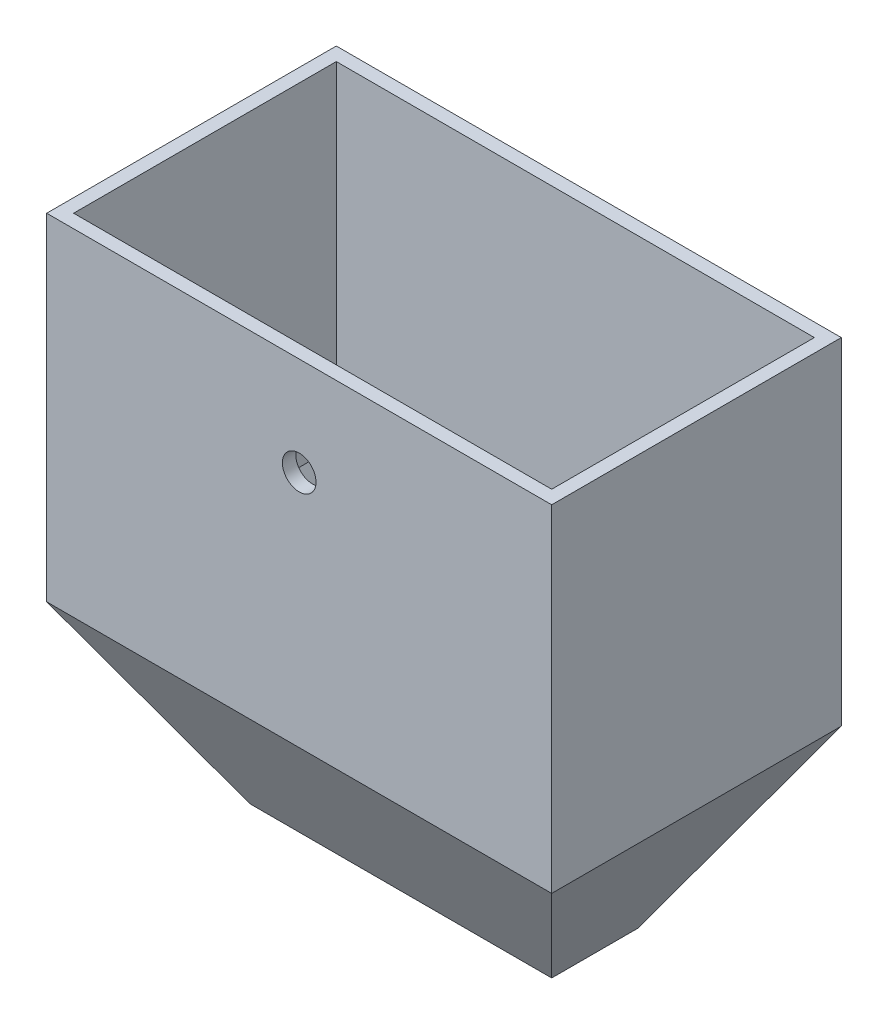
ISO-10303-21;
HEADER;
FILE_DESCRIPTION(('STEP AP214'),'2;1');
FILE_NAME('part.step','',(''),(''),'','','');
FILE_SCHEMA(('AUTOMOTIVE_DESIGN { 1 0 10303 214 1 1 1 1 }'));
ENDSEC;
DATA;
#1=APPLICATION_CONTEXT('core data for automotive mechanical design processes');
#2=APPLICATION_PROTOCOL_DEFINITION('international standard','automotive_design',2000,#1);
#3=PRODUCT_CONTEXT('',#1,'mechanical');
#4=PRODUCT('Part','Part','',(#3));
#5=PRODUCT_RELATED_PRODUCT_CATEGORY('part','',(#4));
#6=PRODUCT_DEFINITION_FORMATION('','',#4);
#7=PRODUCT_DEFINITION_CONTEXT('part definition',#1,'design');
#8=PRODUCT_DEFINITION('design','',#6,#7);
#9=PRODUCT_DEFINITION_SHAPE('','',#8);
#10=(LENGTH_UNIT() NAMED_UNIT(*) SI_UNIT(.MILLI.,.METRE.));
#11=(NAMED_UNIT(*) PLANE_ANGLE_UNIT() SI_UNIT($,.RADIAN.));
#12=(NAMED_UNIT(*) SI_UNIT($,.STERADIAN.) SOLID_ANGLE_UNIT());
#13=UNCERTAINTY_MEASURE_WITH_UNIT(LENGTH_MEASURE(1.E-05),#10,'distance_accuracy_value','');
#14=(GEOMETRIC_REPRESENTATION_CONTEXT(3) GLOBAL_UNCERTAINTY_ASSIGNED_CONTEXT((#13)) GLOBAL_UNIT_ASSIGNED_CONTEXT((#10,
#11,#12)) REPRESENTATION_CONTEXT('',''));
#15=CARTESIAN_POINT('',(0.,0.,0.));
#16=DIRECTION('',(0.,0.,1.));
#17=DIRECTION('',(1.,0.,0.));
#18=AXIS2_PLACEMENT_3D('',#15,#16,#17);
#19=CARTESIAN_POINT('',(187.57,250.,-107.57));
#20=DIRECTION('',(-1.,0.,0.));
#21=DIRECTION('',(0.,0.,1.));
#22=AXIS2_PLACEMENT_3D('',#19,#20,#21);
#23=PLANE('',#22);
#24=DIRECTION('',(0.,0.,1.));
#25=VECTOR('',#24,1.);
#26=CARTESIAN_POINT('',(187.57,0.,-107.57));
#27=LINE('',#26,#25);
#28=CARTESIAN_POINT('',(187.57,0.,107.57));
#29=VERTEX_POINT('',#28);
#30=CARTESIAN_POINT('',(187.57,0.,-107.57));
#31=VERTEX_POINT('',#30);
#32=EDGE_CURVE('E266',#29,#31,#27,.F.);
#33=ORIENTED_EDGE('',*,*,#32,.T.);
#34=DIRECTION('',(0.,-1.,0.));
#35=VECTOR('',#34,1.);
#36=CARTESIAN_POINT('',(187.57,250.,-107.57));
#37=LINE('',#36,#35);
#38=CARTESIAN_POINT('',(187.57,250.,-107.57));
#39=VERTEX_POINT('',#38);
#40=EDGE_CURVE('E12',#39,#31,#37,.T.);
#41=ORIENTED_EDGE('',*,*,#40,.F.);
#42=DIRECTION('',(0.,0.,-1.));
#43=VECTOR('',#42,1.);
#44=CARTESIAN_POINT('',(187.57,250.,-107.57));
#45=LINE('',#44,#43);
#46=CARTESIAN_POINT('',(187.57,250.,107.57));
#47=VERTEX_POINT('',#46);
#48=EDGE_CURVE('E385',#47,#39,#45,.T.);
#49=ORIENTED_EDGE('',*,*,#48,.F.);
#50=DIRECTION('',(0.,-1.,0.));
#51=VECTOR('',#50,1.);
#52=CARTESIAN_POINT('',(187.57,250.,107.57));
#53=LINE('',#52,#51);
#54=EDGE_CURVE('E399',#47,#29,#53,.T.);
#55=ORIENTED_EDGE('',*,*,#54,.T.);
#56=EDGE_LOOP('',(#33,#41,#49,#55));
#57=FACE_BOUND('',#56,.T.);
#58=ADVANCED_FACE('F47',(#57),#23,.F.);
#59=CARTESIAN_POINT('',(-187.57,250.,-107.57));
#60=DIRECTION('',(0.,0.,1.));
#61=DIRECTION('',(1.,0.,0.));
#62=AXIS2_PLACEMENT_3D('',#59,#60,#61);
#63=PLANE('',#62);
#64=DIRECTION('',(1.,0.,0.));
#65=VECTOR('',#64,1.);
#66=CARTESIAN_POINT('',(-187.57,0.,-107.57));
#67=LINE('',#66,#65);
#68=CARTESIAN_POINT('',(-187.57,0.,-107.57));
#69=VERTEX_POINT('',#68);
#70=EDGE_CURVE('E410',#31,#69,#67,.F.);
#71=ORIENTED_EDGE('',*,*,#70,.T.);
#72=DIRECTION('',(0.,-1.,0.));
#73=VECTOR('',#72,1.);
#74=CARTESIAN_POINT('',(-187.57,250.,-107.57));
#75=LINE('',#74,#73);
#76=CARTESIAN_POINT('',(-187.57,250.,-107.57));
#77=VERTEX_POINT('',#76);
#78=EDGE_CURVE('E55',#77,#69,#75,.T.);
#79=ORIENTED_EDGE('',*,*,#78,.F.);
#80=DIRECTION('',(-1.,0.,0.));
#81=VECTOR('',#80,1.);
#82=CARTESIAN_POINT('',(-187.57,250.,-107.57));
#83=LINE('',#82,#81);
#84=EDGE_CURVE('E393',#39,#77,#83,.T.);
#85=ORIENTED_EDGE('',*,*,#84,.F.);
#86=ORIENTED_EDGE('',*,*,#40,.T.);
#87=EDGE_LOOP('',(#71,#79,#85,#86));
#88=FACE_BOUND('',#87,.T.);
#89=ADVANCED_FACE('F430',(#88),#63,.F.);
#90=CARTESIAN_POINT('',(-187.57,250.,-107.57));
#91=DIRECTION('',(1.,0.,0.));
#92=DIRECTION('',(0.,0.,-1.));
#93=AXIS2_PLACEMENT_3D('',#90,#91,#92);
#94=PLANE('',#93);
#95=DIRECTION('',(0.,0.,-1.));
#96=VECTOR('',#95,1.);
#97=CARTESIAN_POINT('',(-187.57,0.,-107.57));
#98=LINE('',#97,#96);
#99=CARTESIAN_POINT('',(-187.57,0.,107.57));
#100=VERTEX_POINT('',#99);
#101=EDGE_CURVE('E407',#69,#100,#98,.F.);
#102=ORIENTED_EDGE('',*,*,#101,.T.);
#103=DIRECTION('',(0.,-1.,0.));
#104=VECTOR('',#103,1.);
#105=CARTESIAN_POINT('',(-187.57,250.,107.57));
#106=LINE('',#105,#104);
#107=CARTESIAN_POINT('',(-187.57,250.,107.57));
#108=VERTEX_POINT('',#107);
#109=EDGE_CURVE('E402',#108,#100,#106,.T.);
#110=ORIENTED_EDGE('',*,*,#109,.F.);
#111=DIRECTION('',(0.,0.,1.));
#112=VECTOR('',#111,1.);
#113=CARTESIAN_POINT('',(-187.57,250.,-107.57));
#114=LINE('',#113,#112);
#115=EDGE_CURVE('E395',#77,#108,#114,.T.);
#116=ORIENTED_EDGE('',*,*,#115,.F.);
#117=ORIENTED_EDGE('',*,*,#78,.T.);
#118=EDGE_LOOP('',(#102,#110,#116,#117));
#119=FACE_BOUND('',#118,.T.);
#120=ADVANCED_FACE('F426',(#119),#94,.F.);
#121=CARTESIAN_POINT('',(-187.57,250.,107.57));
#122=DIRECTION('',(0.,0.,-1.));
#123=DIRECTION('',(-1.,0.,0.));
#124=AXIS2_PLACEMENT_3D('',#121,#122,#123);
#125=PLANE('',#124);
#126=CARTESIAN_POINT('',(0.,177.,107.57));
#127=DIRECTION('',(0.,0.,1.));
#128=DIRECTION('',(1.,0.,0.));
#129=AXIS2_PLACEMENT_3D('',#126,#127,#128);
#130=CIRCLE('',#129,12.5);
#131=CARTESIAN_POINT('',(12.5,177.,107.57));
#132=VERTEX_POINT('',#131);
#133=EDGE_CURVE('E197',#132,#132,#130,.T.);
#134=ORIENTED_EDGE('',*,*,#133,.F.);
#135=EDGE_LOOP('',(#134));
#136=FACE_BOUND('',#135,.T.);
#137=DIRECTION('',(-1.,0.,0.));
#138=VECTOR('',#137,1.);
#139=CARTESIAN_POINT('',(-187.57,0.,107.57));
#140=LINE('',#139,#138);
#141=EDGE_CURVE('E50',#100,#29,#140,.F.);
#142=ORIENTED_EDGE('',*,*,#141,.T.);
#143=ORIENTED_EDGE('',*,*,#54,.F.);
#144=DIRECTION('',(1.,0.,0.));
#145=VECTOR('',#144,1.);
#146=CARTESIAN_POINT('',(-187.57,250.,107.57));
#147=LINE('',#146,#145);
#148=EDGE_CURVE('E397',#108,#47,#147,.T.);
#149=ORIENTED_EDGE('',*,*,#148,.F.);
#150=ORIENTED_EDGE('',*,*,#109,.T.);
#151=EDGE_LOOP('',(#142,#143,#149,#150));
#152=FACE_BOUND('',#151,.T.);
#153=ADVANCED_FACE('F422',(#136,#152),#125,.F.);
#154=CARTESIAN_POINT('',(0.,250.,0.));
#155=DIRECTION('',(0.,1.,0.));
#156=DIRECTION('',(0.,0.,1.));
#157=AXIS2_PLACEMENT_3D('',#154,#155,#156);
#158=PLANE('',#157);
#159=DIRECTION('',(0.,0.,-1.));
#160=VECTOR('',#159,1.);
#161=CARTESIAN_POINT('',(177.57,250.,-107.57));
#162=LINE('',#161,#160);
#163=CARTESIAN_POINT('',(177.57,250.,97.57));
#164=VERTEX_POINT('',#163);
#165=CARTESIAN_POINT('',(177.57,250.,-97.57));
#166=VERTEX_POINT('',#165);
#167=EDGE_CURVE('E232',#164,#166,#162,.T.);
#168=ORIENTED_EDGE('',*,*,#167,.F.);
#169=DIRECTION('',(1.,0.,0.));
#170=VECTOR('',#169,1.);
#171=CARTESIAN_POINT('',(-187.57,250.,97.57));
#172=LINE('',#171,#170);
#173=CARTESIAN_POINT('',(-177.57,250.,97.57));
#174=VERTEX_POINT('',#173);
#175=EDGE_CURVE('E220',#174,#164,#172,.T.);
#176=ORIENTED_EDGE('',*,*,#175,.F.);
#177=DIRECTION('',(0.,0.,1.));
#178=VECTOR('',#177,1.);
#179=CARTESIAN_POINT('',(-177.57,250.,-107.57));
#180=LINE('',#179,#178);
#181=CARTESIAN_POINT('',(-177.57,250.,-97.57));
#182=VERTEX_POINT('',#181);
#183=EDGE_CURVE('E254',#182,#174,#180,.T.);
#184=ORIENTED_EDGE('',*,*,#183,.F.);
#185=DIRECTION('',(-1.,0.,0.));
#186=VECTOR('',#185,1.);
#187=CARTESIAN_POINT('',(-187.57,250.,-97.57));
#188=LINE('',#187,#186);
#189=EDGE_CURVE('E252',#166,#182,#188,.T.);
#190=ORIENTED_EDGE('',*,*,#189,.F.);
#191=EDGE_LOOP('',(#168,#176,#184,#190));
#192=FACE_BOUND('',#191,.T.);
#193=ORIENTED_EDGE('',*,*,#48,.T.);
#194=ORIENTED_EDGE('',*,*,#84,.T.);
#195=ORIENTED_EDGE('',*,*,#115,.T.);
#196=ORIENTED_EDGE('',*,*,#148,.T.);
#197=EDGE_LOOP('',(#193,#194,#195,#196));
#198=FACE_BOUND('',#197,.T.);
#199=ADVANCED_FACE('F357',(#192,#198),#158,.T.);
#200=CARTESIAN_POINT('',(0.,-130.,0.));
#201=DIRECTION('',(0.,1.,0.));
#202=DIRECTION('',(0.,0.,1.));
#203=AXIS2_PLACEMENT_3D('',#200,#201,#202);
#204=PLANE('',#203);
#205=DIRECTION('',(-1.,0.,0.));
#206=VECTOR('',#205,1.);
#207=CARTESIAN_POINT('',(-107.,-130.,27.));
#208=LINE('',#207,#206);
#209=CARTESIAN_POINT('',(107.,-130.,27.));
#210=VERTEX_POINT('',#209);
#211=CARTESIAN_POINT('',(-107.,-130.,27.));
#212=VERTEX_POINT('',#211);
#213=EDGE_CURVE('E191',#210,#212,#208,.T.);
#214=ORIENTED_EDGE('',*,*,#213,.F.);
#215=DIRECTION('',(0.,0.,1.));
#216=VECTOR('',#215,1.);
#217=CARTESIAN_POINT('',(107.,-130.,27.));
#218=LINE('',#217,#216);
#219=CARTESIAN_POINT('',(107.,-130.,-27.));
#220=VERTEX_POINT('',#219);
#221=EDGE_CURVE('E63',#220,#210,#218,.T.);
#222=ORIENTED_EDGE('',*,*,#221,.F.);
#223=DIRECTION('',(1.,0.,0.));
#224=VECTOR('',#223,1.);
#225=CARTESIAN_POINT('',(-107.,-130.,-27.));
#226=LINE('',#225,#224);
#227=CARTESIAN_POINT('',(-107.,-130.,-27.));
#228=VERTEX_POINT('',#227);
#229=EDGE_CURVE('E182',#228,#220,#226,.T.);
#230=ORIENTED_EDGE('',*,*,#229,.F.);
#231=DIRECTION('',(0.,0.,-1.));
#232=VECTOR('',#231,1.);
#233=CARTESIAN_POINT('',(-107.,-130.,27.));
#234=LINE('',#233,#232);
#235=EDGE_CURVE('E185',#212,#228,#234,.T.);
#236=ORIENTED_EDGE('',*,*,#235,.F.);
#237=EDGE_LOOP('',(#214,#222,#230,#236));
#238=FACE_BOUND('',#237,.T.);
#239=DIRECTION('',(0.,0.,-1.));
#240=VECTOR('',#239,1.);
#241=CARTESIAN_POINT('',(112.,-130.,-32.));
#242=LINE('',#241,#240);
#243=CARTESIAN_POINT('',(112.,-130.,32.));
#244=VERTEX_POINT('',#243);
#245=CARTESIAN_POINT('',(112.,-130.,-32.));
#246=VERTEX_POINT('',#245);
#247=EDGE_CURVE('E215',#244,#246,#242,.T.);
#248=ORIENTED_EDGE('',*,*,#247,.F.);
#249=DIRECTION('',(1.,0.,0.));
#250=VECTOR('',#249,1.);
#251=CARTESIAN_POINT('',(-112.,-130.,32.));
#252=LINE('',#251,#250);
#253=CARTESIAN_POINT('',(-112.,-130.,32.));
#254=VERTEX_POINT('',#253);
#255=EDGE_CURVE('E373',#254,#244,#252,.T.);
#256=ORIENTED_EDGE('',*,*,#255,.F.);
#257=DIRECTION('',(0.,0.,1.));
#258=VECTOR('',#257,1.);
#259=CARTESIAN_POINT('',(-112.,-130.,-32.));
#260=LINE('',#259,#258);
#261=CARTESIAN_POINT('',(-112.,-130.,-32.));
#262=VERTEX_POINT('',#261);
#263=EDGE_CURVE('E323',#262,#254,#260,.T.);
#264=ORIENTED_EDGE('',*,*,#263,.F.);
#265=DIRECTION('',(-1.,0.,0.));
#266=VECTOR('',#265,1.);
#267=CARTESIAN_POINT('',(-112.,-130.,-32.));
#268=LINE('',#267,#266);
#269=EDGE_CURVE('E271',#246,#262,#268,.T.);
#270=ORIENTED_EDGE('',*,*,#269,.F.);
#271=EDGE_LOOP('',(#248,#256,#264,#270));
#272=FACE_BOUND('',#271,.T.);
#273=ADVANCED_FACE('F348',(#238,#272),#204,.F.);
#274=CARTESIAN_POINT('',(140.195371642545,-81.4966479617468,0.));
#275=DIRECTION('',(0.864540113802195,-0.502563818461783,0.));
#276=DIRECTION('',(0.502563818461783,0.864540113802195,0.));
#277=AXIS2_PLACEMENT_3D('',#274,#275,#276);
#278=PLANE('',#277);
#279=DIRECTION('',(-0.449045292641389,-0.77247436870955,-0.44904529264139));
#280=VECTOR('',#279,1.);
#281=CARTESIAN_POINT('',(187.57,0.,107.57));
#282=LINE('',#281,#280);
#283=EDGE_CURVE('E261',#29,#244,#282,.T.);
#284=ORIENTED_EDGE('',*,*,#283,.T.);
#285=ORIENTED_EDGE('',*,*,#247,.T.);
#286=DIRECTION('',(-0.449045292641389,-0.77247436870955,0.44904529264139));
#287=VECTOR('',#286,1.);
#288=CARTESIAN_POINT('',(187.57,0.,-107.57));
#289=LINE('',#288,#287);
#290=EDGE_CURVE('E257',#31,#246,#289,.T.);
#291=ORIENTED_EDGE('',*,*,#290,.F.);
#292=ORIENTED_EDGE('',*,*,#32,.F.);
#293=EDGE_LOOP('',(#284,#285,#291,#292));
#294=FACE_BOUND('',#293,.T.);
#295=ADVANCED_FACE('F300',(#294),#278,.T.);
#296=CARTESIAN_POINT('',(0.,-46.7377214972816,-80.4010029726956));
#297=DIRECTION('',(0.,-0.502563818461784,-0.864540113802195));
#298=DIRECTION('',(0.,0.864540113802195,-0.502563818461784));
#299=AXIS2_PLACEMENT_3D('',#296,#297,#298);
#300=PLANE('',#299);
#301=ORIENTED_EDGE('',*,*,#290,.T.);
#302=ORIENTED_EDGE('',*,*,#269,.T.);
#303=DIRECTION('',(0.44904529264139,-0.772474368709549,0.44904529264139));
#304=VECTOR('',#303,1.);
#305=CARTESIAN_POINT('',(-187.57,0.,-107.57));
#306=LINE('',#305,#304);
#307=EDGE_CURVE('E264',#69,#262,#306,.T.);
#308=ORIENTED_EDGE('',*,*,#307,.F.);
#309=ORIENTED_EDGE('',*,*,#70,.F.);
#310=EDGE_LOOP('',(#301,#302,#308,#309));
#311=FACE_BOUND('',#310,.T.);
#312=ADVANCED_FACE('F289',(#311),#300,.T.);
#313=CARTESIAN_POINT('',(0.,-46.7377214972816,80.4010029726956));
#314=DIRECTION('',(0.,-0.502563818461783,0.864540113802195));
#315=DIRECTION('',(0.,-0.864540113802195,-0.502563818461783));
#316=AXIS2_PLACEMENT_3D('',#313,#314,#315);
#317=PLANE('',#316);
#318=DIRECTION('',(0.44904529264139,-0.77247436870955,-0.44904529264139));
#319=VECTOR('',#318,1.);
#320=CARTESIAN_POINT('',(-187.57,0.,107.57));
#321=LINE('',#320,#319);
#322=EDGE_CURVE('E260',#100,#254,#321,.T.);
#323=ORIENTED_EDGE('',*,*,#322,.T.);
#324=ORIENTED_EDGE('',*,*,#255,.T.);
#325=ORIENTED_EDGE('',*,*,#283,.F.);
#326=ORIENTED_EDGE('',*,*,#141,.F.);
#327=EDGE_LOOP('',(#323,#324,#325,#326));
#328=FACE_BOUND('',#327,.T.);
#329=ADVANCED_FACE('F299',(#328),#317,.T.);
#330=CARTESIAN_POINT('',(-140.195371642545,-81.4966479617469,0.));
#331=DIRECTION('',(-0.864540113802195,-0.502563818461784,0.));
#332=DIRECTION('',(0.502563818461784,-0.864540113802195,0.));
#333=AXIS2_PLACEMENT_3D('',#330,#331,#332);
#334=PLANE('',#333);
#335=ORIENTED_EDGE('',*,*,#307,.T.);
#336=ORIENTED_EDGE('',*,*,#263,.T.);
#337=ORIENTED_EDGE('',*,*,#322,.F.);
#338=ORIENTED_EDGE('',*,*,#101,.F.);
#339=EDGE_LOOP('',(#335,#336,#337,#338));
#340=FACE_BOUND('',#339,.T.);
#341=ADVANCED_FACE('F306',(#340),#334,.T.);
#342=CARTESIAN_POINT('',(177.57,250.,-107.57));
#343=DIRECTION('',(-1.,0.,0.));
#344=DIRECTION('',(0.,0.,1.));
#345=AXIS2_PLACEMENT_3D('',#342,#343,#344);
#346=PLANE('',#345);
#347=DIRECTION('',(0.,0.,-1.));
#348=VECTOR('',#347,1.);
#349=CARTESIAN_POINT('',(177.57,2.69537681030069,0.));
#350=LINE('',#349,#348);
#351=CARTESIAN_POINT('',(177.57,2.69537681030067,97.57));
#352=VERTEX_POINT('',#351);
#353=CARTESIAN_POINT('',(177.57,2.69537681030069,-97.57));
#354=VERTEX_POINT('',#353);
#355=EDGE_CURVE('E207',#352,#354,#350,.T.);
#356=ORIENTED_EDGE('',*,*,#355,.F.);
#357=DIRECTION('',(0.,-1.,0.));
#358=VECTOR('',#357,1.);
#359=CARTESIAN_POINT('',(177.57,250.,97.57));
#360=LINE('',#359,#358);
#361=EDGE_CURVE('E217',#164,#352,#360,.T.);
#362=ORIENTED_EDGE('',*,*,#361,.F.);
#363=ORIENTED_EDGE('',*,*,#167,.T.);
#364=DIRECTION('',(0.,-1.,0.));
#365=VECTOR('',#364,1.);
#366=CARTESIAN_POINT('',(177.57,250.,-97.57));
#367=LINE('',#366,#365);
#368=EDGE_CURVE('E212',#166,#354,#367,.T.);
#369=ORIENTED_EDGE('',*,*,#368,.T.);
#370=EDGE_LOOP('',(#356,#362,#363,#369));
#371=FACE_BOUND('',#370,.T.);
#372=ADVANCED_FACE('F576',(#371),#346,.T.);
#373=CARTESIAN_POINT('',(-187.57,250.,-97.57));
#374=DIRECTION('',(0.,0.,1.));
#375=DIRECTION('',(1.,0.,0.));
#376=AXIS2_PLACEMENT_3D('',#373,#374,#375);
#377=PLANE('',#376);
#378=DIRECTION('',(-1.,0.,0.));
#379=VECTOR('',#378,1.);
#380=CARTESIAN_POINT('',(0.,2.69537681030065,-97.57));
#381=LINE('',#380,#379);
#382=CARTESIAN_POINT('',(-177.57,2.69537681030063,-97.57));
#383=VERTEX_POINT('',#382);
#384=EDGE_CURVE('E210',#354,#383,#381,.T.);
#385=ORIENTED_EDGE('',*,*,#384,.F.);
#386=ORIENTED_EDGE('',*,*,#368,.F.);
#387=ORIENTED_EDGE('',*,*,#189,.T.);
#388=DIRECTION('',(0.,-1.,0.));
#389=VECTOR('',#388,1.);
#390=CARTESIAN_POINT('',(-177.57,250.,-97.57));
#391=LINE('',#390,#389);
#392=EDGE_CURVE('E216',#182,#383,#391,.T.);
#393=ORIENTED_EDGE('',*,*,#392,.T.);
#394=EDGE_LOOP('',(#385,#386,#387,#393));
#395=FACE_BOUND('',#394,.T.);
#396=ADVANCED_FACE('F579',(#395),#377,.T.);
#397=CARTESIAN_POINT('',(-177.57,250.,-107.57));
#398=DIRECTION('',(1.,0.,0.));
#399=DIRECTION('',(0.,0.,-1.));
#400=AXIS2_PLACEMENT_3D('',#397,#398,#399);
#401=PLANE('',#400);
#402=DIRECTION('',(0.,0.,1.));
#403=VECTOR('',#402,1.);
#404=CARTESIAN_POINT('',(-177.57,2.69537681030065,0.));
#405=LINE('',#404,#403);
#406=CARTESIAN_POINT('',(-177.57,2.69537681030069,97.57));
#407=VERTEX_POINT('',#406);
#408=EDGE_CURVE('E223',#383,#407,#405,.T.);
#409=ORIENTED_EDGE('',*,*,#408,.F.);
#410=ORIENTED_EDGE('',*,*,#392,.F.);
#411=ORIENTED_EDGE('',*,*,#183,.T.);
#412=DIRECTION('',(0.,-1.,0.));
#413=VECTOR('',#412,1.);
#414=CARTESIAN_POINT('',(-177.57,250.,97.57));
#415=LINE('',#414,#413);
#416=EDGE_CURVE('E71',#174,#407,#415,.T.);
#417=ORIENTED_EDGE('',*,*,#416,.T.);
#418=EDGE_LOOP('',(#409,#410,#411,#417));
#419=FACE_BOUND('',#418,.T.);
#420=ADVANCED_FACE('F462',(#419),#401,.T.);
#421=CARTESIAN_POINT('',(-187.57,250.,97.57));
#422=DIRECTION('',(0.,0.,-1.));
#423=DIRECTION('',(-1.,0.,0.));
#424=AXIS2_PLACEMENT_3D('',#421,#422,#423);
#425=PLANE('',#424);
#426=CARTESIAN_POINT('',(0.,177.,97.57));
#427=DIRECTION('',(0.,0.,1.));
#428=DIRECTION('',(1.,0.,0.));
#429=AXIS2_PLACEMENT_3D('',#426,#427,#428);
#430=CIRCLE('',#429,12.5);
#431=CARTESIAN_POINT('',(12.5,177.,97.57));
#432=VERTEX_POINT('',#431);
#433=EDGE_CURVE('E201',#432,#432,#430,.T.);
#434=ORIENTED_EDGE('',*,*,#433,.T.);
#435=EDGE_LOOP('',(#434));
#436=FACE_BOUND('',#435,.T.);
#437=DIRECTION('',(1.,0.,0.));
#438=VECTOR('',#437,1.);
#439=CARTESIAN_POINT('',(0.,2.69537681030071,97.57));
#440=LINE('',#439,#438);
#441=EDGE_CURVE('E228',#407,#352,#440,.T.);
#442=ORIENTED_EDGE('',*,*,#441,.F.);
#443=ORIENTED_EDGE('',*,*,#416,.F.);
#444=ORIENTED_EDGE('',*,*,#175,.T.);
#445=ORIENTED_EDGE('',*,*,#361,.T.);
#446=EDGE_LOOP('',(#442,#443,#444,#445));
#447=FACE_BOUND('',#446,.T.);
#448=ADVANCED_FACE('F467',(#436,#447),#425,.T.);
#449=CARTESIAN_POINT('',(131.549970504523,-76.4710097771289,0.));
#450=DIRECTION('',(0.864540113802195,-0.502563818461783,0.));
#451=DIRECTION('',(0.502563818461783,0.864540113802195,0.));
#452=AXIS2_PLACEMENT_3D('',#449,#450,#451);
#453=PLANE('',#452);
#454=DIRECTION('',(-0.449045292641389,-0.77247436870955,-0.44904529264139));
#455=VECTOR('',#454,1.);
#456=CARTESIAN_POINT('',(121.155348113863,-94.3524562609945,41.1553481138633));
#457=LINE('',#456,#455);
#458=CARTESIAN_POINT('',(106.246233649581,-120.,26.2462336495814));
#459=VERTEX_POINT('',#458);
#460=EDGE_CURVE('E233',#352,#459,#457,.T.);
#461=ORIENTED_EDGE('',*,*,#460,.F.);
#462=ORIENTED_EDGE('',*,*,#355,.T.);
#463=DIRECTION('',(-0.449045292641389,-0.77247436870955,0.44904529264139));
#464=VECTOR('',#463,1.);
#465=CARTESIAN_POINT('',(121.155348113863,-94.3524562609945,-41.1553481138633));
#466=LINE('',#465,#464);
#467=CARTESIAN_POINT('',(106.246233649581,-120.,-26.2462336495814));
#468=VERTEX_POINT('',#467);
#469=EDGE_CURVE('E236',#354,#468,#466,.T.);
#470=ORIENTED_EDGE('',*,*,#469,.T.);
#471=DIRECTION('',(0.,0.,-1.));
#472=VECTOR('',#471,1.);
#473=CARTESIAN_POINT('',(106.246233649581,-120.,0.));
#474=LINE('',#473,#472);
#475=EDGE_CURVE('E204',#459,#468,#474,.T.);
#476=ORIENTED_EDGE('',*,*,#475,.F.);
#477=EDGE_LOOP('',(#461,#462,#470,#476));
#478=FACE_BOUND('',#477,.T.);
#479=ADVANCED_FACE('F472',(#478),#453,.F.);
#480=CARTESIAN_POINT('',(0.,-41.7120833126638,-71.7556018346737));
#481=DIRECTION('',(0.,-0.502563818461784,-0.864540113802195));
#482=DIRECTION('',(0.,0.864540113802195,-0.502563818461784));
#483=AXIS2_PLACEMENT_3D('',#480,#481,#482);
#484=PLANE('',#483);
#485=ORIENTED_EDGE('',*,*,#469,.F.);
#486=ORIENTED_EDGE('',*,*,#384,.T.);
#487=DIRECTION('',(0.44904529264139,-0.772474368709549,0.44904529264139));
#488=VECTOR('',#487,1.);
#489=CARTESIAN_POINT('',(-121.155348113863,-94.3524562609946,-41.1553481138632));
#490=LINE('',#489,#488);
#491=CARTESIAN_POINT('',(-106.246233649581,-120.,-26.2462336495814));
#492=VERTEX_POINT('',#491);
#493=EDGE_CURVE('E211',#383,#492,#490,.T.);
#494=ORIENTED_EDGE('',*,*,#493,.T.);
#495=DIRECTION('',(-1.,0.,0.));
#496=VECTOR('',#495,1.);
#497=CARTESIAN_POINT('',(0.,-120.,-26.2462336495814));
#498=LINE('',#497,#496);
#499=EDGE_CURVE('E237',#468,#492,#498,.T.);
#500=ORIENTED_EDGE('',*,*,#499,.F.);
#501=EDGE_LOOP('',(#485,#486,#494,#500));
#502=FACE_BOUND('',#501,.T.);
#503=ADVANCED_FACE('F504',(#502),#484,.F.);
#504=CARTESIAN_POINT('',(0.,-41.7120833126637,71.7556018346737));
#505=DIRECTION('',(0.,-0.502563818461783,0.864540113802195));
#506=DIRECTION('',(0.,-0.864540113802195,-0.502563818461783));
#507=AXIS2_PLACEMENT_3D('',#504,#505,#506);
#508=PLANE('',#507);
#509=DIRECTION('',(0.44904529264139,-0.77247436870955,-0.44904529264139));
#510=VECTOR('',#509,1.);
#511=CARTESIAN_POINT('',(-121.155348113863,-94.3524562609945,41.1553481138632));
#512=LINE('',#511,#510);
#513=CARTESIAN_POINT('',(-106.246233649581,-120.,26.2462336495814));
#514=VERTEX_POINT('',#513);
#515=EDGE_CURVE('E242',#407,#514,#512,.T.);
#516=ORIENTED_EDGE('',*,*,#515,.F.);
#517=ORIENTED_EDGE('',*,*,#441,.T.);
#518=ORIENTED_EDGE('',*,*,#460,.T.);
#519=DIRECTION('',(1.,0.,0.));
#520=VECTOR('',#519,1.);
#521=CARTESIAN_POINT('',(0.,-120.,26.2462336495814));
#522=LINE('',#521,#520);
#523=EDGE_CURVE('E239',#514,#459,#522,.T.);
#524=ORIENTED_EDGE('',*,*,#523,.F.);
#525=EDGE_LOOP('',(#516,#517,#518,#524));
#526=FACE_BOUND('',#525,.T.);
#527=ADVANCED_FACE('F514',(#526),#508,.F.);
#528=CARTESIAN_POINT('',(-131.549970504523,-76.4710097771291,0.));
#529=DIRECTION('',(-0.864540113802195,-0.502563818461784,0.));
#530=DIRECTION('',(0.502563818461784,-0.864540113802195,0.));
#531=AXIS2_PLACEMENT_3D('',#528,#529,#530);
#532=PLANE('',#531);
#533=ORIENTED_EDGE('',*,*,#493,.F.);
#534=ORIENTED_EDGE('',*,*,#408,.T.);
#535=ORIENTED_EDGE('',*,*,#515,.T.);
#536=DIRECTION('',(0.,0.,1.));
#537=VECTOR('',#536,1.);
#538=CARTESIAN_POINT('',(-106.246233649581,-120.,0.));
#539=LINE('',#538,#537);
#540=EDGE_CURVE('E244',#492,#514,#539,.T.);
#541=ORIENTED_EDGE('',*,*,#540,.F.);
#542=EDGE_LOOP('',(#533,#534,#535,#541));
#543=FACE_BOUND('',#542,.T.);
#544=ADVANCED_FACE('F359',(#543),#532,.F.);
#545=CARTESIAN_POINT('',(0.,177.,97.57));
#546=DIRECTION('',(0.,0.,1.));
#547=DIRECTION('',(1.,0.,0.));
#548=AXIS2_PLACEMENT_3D('',#545,#546,#547);
#549=CYLINDRICAL_SURFACE('',#548,12.5);
#550=ORIENTED_EDGE('',*,*,#433,.F.);
#551=EDGE_LOOP('',(#550));
#552=FACE_BOUND('',#551,.T.);
#553=ORIENTED_EDGE('',*,*,#133,.T.);
#554=EDGE_LOOP('',(#553));
#555=FACE_BOUND('',#554,.T.);
#556=ADVANCED_FACE('F480',(#552,#555),#549,.F.);
#557=CARTESIAN_POINT('',(0.,-120.,0.));
#558=DIRECTION('',(0.,-1.,0.));
#559=DIRECTION('',(0.,0.,-1.));
#560=AXIS2_PLACEMENT_3D('',#557,#558,#559);
#561=PLANE('',#560);
#562=DIRECTION('',(0.,0.,1.));
#563=VECTOR('',#562,1.);
#564=CARTESIAN_POINT('',(107.,-120.,27.));
#565=LINE('',#564,#563);
#566=CARTESIAN_POINT('',(107.,-120.,-27.));
#567=VERTEX_POINT('',#566);
#568=CARTESIAN_POINT('',(107.,-120.,27.));
#569=VERTEX_POINT('',#568);
#570=EDGE_CURVE('E163',#567,#569,#565,.T.);
#571=ORIENTED_EDGE('',*,*,#570,.T.);
#572=DIRECTION('',(-1.,0.,0.));
#573=VECTOR('',#572,1.);
#574=CARTESIAN_POINT('',(-107.,-120.,27.));
#575=LINE('',#574,#573);
#576=CARTESIAN_POINT('',(-107.,-120.,27.));
#577=VERTEX_POINT('',#576);
#578=EDGE_CURVE('E172',#569,#577,#575,.T.);
#579=ORIENTED_EDGE('',*,*,#578,.T.);
#580=DIRECTION('',(0.,0.,-1.));
#581=VECTOR('',#580,1.);
#582=CARTESIAN_POINT('',(-107.,-120.,27.));
#583=LINE('',#582,#581);
#584=CARTESIAN_POINT('',(-107.,-120.,-27.));
#585=VERTEX_POINT('',#584);
#586=EDGE_CURVE('E177',#577,#585,#583,.T.);
#587=ORIENTED_EDGE('',*,*,#586,.T.);
#588=DIRECTION('',(1.,0.,0.));
#589=VECTOR('',#588,1.);
#590=CARTESIAN_POINT('',(-107.,-120.,-27.));
#591=LINE('',#590,#589);
#592=EDGE_CURVE('E169',#585,#567,#591,.T.);
#593=ORIENTED_EDGE('',*,*,#592,.T.);
#594=EDGE_LOOP('',(#571,#579,#587,#593));
#595=FACE_BOUND('',#594,.T.);
#596=ORIENTED_EDGE('',*,*,#475,.T.);
#597=ORIENTED_EDGE('',*,*,#499,.T.);
#598=ORIENTED_EDGE('',*,*,#540,.T.);
#599=ORIENTED_EDGE('',*,*,#523,.T.);
#600=EDGE_LOOP('',(#596,#597,#598,#599));
#601=FACE_BOUND('',#600,.T.);
#602=ADVANCED_FACE('F179',(#595,#601),#561,.T.);
#603=CARTESIAN_POINT('',(107.,-120.,27.));
#604=DIRECTION('',(1.,0.,0.));
#605=DIRECTION('',(0.,0.,-1.));
#606=AXIS2_PLACEMENT_3D('',#603,#604,#605);
#607=PLANE('',#606);
#608=ORIENTED_EDGE('',*,*,#221,.T.);
#609=DIRECTION('',(0.,-1.,0.));
#610=VECTOR('',#609,1.);
#611=CARTESIAN_POINT('',(107.,-120.,27.));
#612=LINE('',#611,#610);
#613=EDGE_CURVE('E159',#569,#210,#612,.T.);
#614=ORIENTED_EDGE('',*,*,#613,.F.);
#615=ORIENTED_EDGE('',*,*,#570,.F.);
#616=DIRECTION('',(0.,-1.,0.));
#617=VECTOR('',#616,1.);
#618=CARTESIAN_POINT('',(107.,-120.,-27.));
#619=LINE('',#618,#617);
#620=EDGE_CURVE('E195',#567,#220,#619,.T.);
#621=ORIENTED_EDGE('',*,*,#620,.T.);
#622=EDGE_LOOP('',(#608,#614,#615,#621));
#623=FACE_BOUND('',#622,.T.);
#624=ADVANCED_FACE('F161',(#623),#607,.F.);
#625=CARTESIAN_POINT('',(-107.,-120.,-27.));
#626=DIRECTION('',(0.,0.,-1.));
#627=DIRECTION('',(-1.,0.,0.));
#628=AXIS2_PLACEMENT_3D('',#625,#626,#627);
#629=PLANE('',#628);
#630=ORIENTED_EDGE('',*,*,#229,.T.);
#631=ORIENTED_EDGE('',*,*,#620,.F.);
#632=ORIENTED_EDGE('',*,*,#592,.F.);
#633=DIRECTION('',(0.,-1.,0.));
#634=VECTOR('',#633,1.);
#635=CARTESIAN_POINT('',(-107.,-120.,-27.));
#636=LINE('',#635,#634);
#637=EDGE_CURVE('E198',#585,#228,#636,.T.);
#638=ORIENTED_EDGE('',*,*,#637,.T.);
#639=EDGE_LOOP('',(#630,#631,#632,#638));
#640=FACE_BOUND('',#639,.T.);
#641=ADVANCED_FACE('F544',(#640),#629,.F.);
#642=CARTESIAN_POINT('',(-107.,-120.,27.));
#643=DIRECTION('',(-1.,0.,0.));
#644=DIRECTION('',(0.,0.,1.));
#645=AXIS2_PLACEMENT_3D('',#642,#643,#644);
#646=PLANE('',#645);
#647=ORIENTED_EDGE('',*,*,#235,.T.);
#648=ORIENTED_EDGE('',*,*,#637,.F.);
#649=ORIENTED_EDGE('',*,*,#586,.F.);
#650=DIRECTION('',(0.,-1.,0.));
#651=VECTOR('',#650,1.);
#652=CARTESIAN_POINT('',(-107.,-120.,27.));
#653=LINE('',#652,#651);
#654=EDGE_CURVE('E168',#577,#212,#653,.T.);
#655=ORIENTED_EDGE('',*,*,#654,.T.);
#656=EDGE_LOOP('',(#647,#648,#649,#655));
#657=FACE_BOUND('',#656,.T.);
#658=ADVANCED_FACE('F553',(#657),#646,.F.);
#659=CARTESIAN_POINT('',(-107.,-120.,27.));
#660=DIRECTION('',(0.,0.,1.));
#661=DIRECTION('',(1.,0.,0.));
#662=AXIS2_PLACEMENT_3D('',#659,#660,#661);
#663=PLANE('',#662);
#664=ORIENTED_EDGE('',*,*,#213,.T.);
#665=ORIENTED_EDGE('',*,*,#654,.F.);
#666=ORIENTED_EDGE('',*,*,#578,.F.);
#667=ORIENTED_EDGE('',*,*,#613,.T.);
#668=EDGE_LOOP('',(#664,#665,#666,#667));
#669=FACE_BOUND('',#668,.T.);
#670=ADVANCED_FACE('F173',(#669),#663,.F.);
#671=CLOSED_SHELL('',(#58,#89,#120,#153,#199,#273,#295,#312,#329,#341,#372,#396,#420,#448,#479,
#503,#527,#544,#556,#602,#624,#641,#658,#670));
#672=MANIFOLD_SOLID_BREP('B2',#671);
#673=ADVANCED_BREP_SHAPE_REPRESENTATION('',(#18,#672),#14);
#674=SHAPE_DEFINITION_REPRESENTATION(#9,#673);
ENDSEC;
END-ISO-10303-21;
